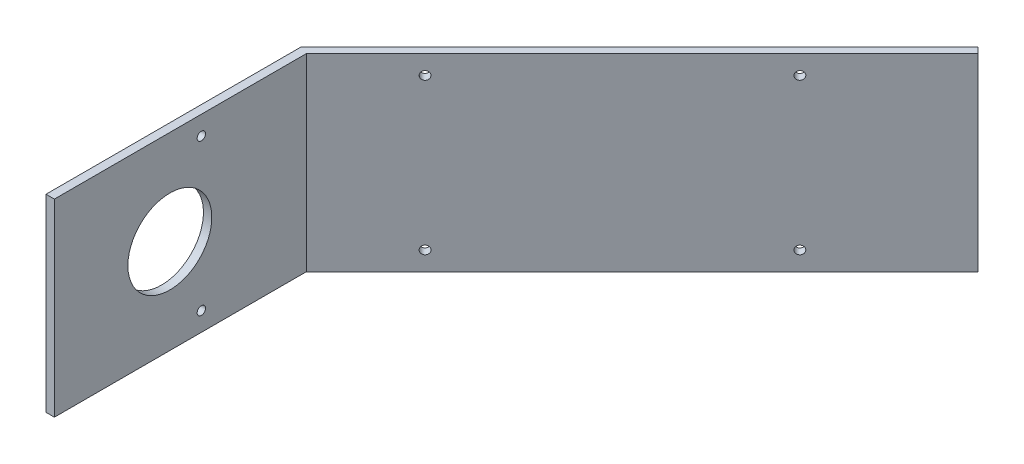
ISO-10303-21;
HEADER;
FILE_DESCRIPTION(('STEP AP214'),'2;1');
FILE_NAME('part.step','',(''),(''),'','','');
FILE_SCHEMA(('AUTOMOTIVE_DESIGN { 1 0 10303 214 1 1 1 1 }'));
ENDSEC;
DATA;
#1=APPLICATION_CONTEXT('core data for automotive mechanical design processes');
#2=APPLICATION_PROTOCOL_DEFINITION('international standard','automotive_design',2000,#1);
#3=PRODUCT_CONTEXT('',#1,'mechanical');
#4=PRODUCT('Part','Part','',(#3));
#5=PRODUCT_RELATED_PRODUCT_CATEGORY('part','',(#4));
#6=PRODUCT_DEFINITION_FORMATION('','',#4);
#7=PRODUCT_DEFINITION_CONTEXT('part definition',#1,'design');
#8=PRODUCT_DEFINITION('design','',#6,#7);
#9=PRODUCT_DEFINITION_SHAPE('','',#8);
#10=(LENGTH_UNIT() NAMED_UNIT(*) SI_UNIT(.MILLI.,.METRE.));
#11=(NAMED_UNIT(*) PLANE_ANGLE_UNIT() SI_UNIT($,.RADIAN.));
#12=(NAMED_UNIT(*) SI_UNIT($,.STERADIAN.) SOLID_ANGLE_UNIT());
#13=UNCERTAINTY_MEASURE_WITH_UNIT(LENGTH_MEASURE(1.E-05),#10,'distance_accuracy_value','');
#14=(GEOMETRIC_REPRESENTATION_CONTEXT(3) GLOBAL_UNCERTAINTY_ASSIGNED_CONTEXT((#13)) GLOBAL_UNIT_ASSIGNED_CONTEXT((#10,
#11,#12)) REPRESENTATION_CONTEXT('',''));
#15=CARTESIAN_POINT('',(0.,0.,0.));
#16=DIRECTION('',(0.,0.,1.));
#17=DIRECTION('',(1.,0.,0.));
#18=AXIS2_PLACEMENT_3D('',#15,#16,#17);
#19=CARTESIAN_POINT('',(0.,45.,0.));
#20=DIRECTION('',(0.,0.,-1.));
#21=DIRECTION('',(-1.,0.,0.));
#22=AXIS2_PLACEMENT_3D('',#19,#20,#21);
#23=PLANE('',#22);
#24=DIRECTION('',(1.,0.,0.));
#25=VECTOR('',#24,1.);
#26=CARTESIAN_POINT('',(0.,-45.,0.));
#27=LINE('',#26,#25);
#28=CARTESIAN_POINT('',(-4.,-45.,0.));
#29=VERTEX_POINT('',#28);
#30=CARTESIAN_POINT('',(0.,-45.,0.));
#31=VERTEX_POINT('',#30);
#32=EDGE_CURVE('E123',#29,#31,#27,.T.);
#33=ORIENTED_EDGE('',*,*,#32,.T.);
#34=DIRECTION('',(0.,-1.,0.));
#35=VECTOR('',#34,1.);
#36=CARTESIAN_POINT('',(0.,45.,0.));
#37=LINE('',#36,#35);
#38=CARTESIAN_POINT('',(0.,45.,0.));
#39=VERTEX_POINT('',#38);
#40=EDGE_CURVE('E11',#39,#31,#37,.T.);
#41=ORIENTED_EDGE('',*,*,#40,.F.);
#42=DIRECTION('',(1.,0.,0.));
#43=VECTOR('',#42,1.);
#44=CARTESIAN_POINT('',(0.,45.,0.));
#45=LINE('',#44,#43);
#46=CARTESIAN_POINT('',(-4.,45.,0.));
#47=VERTEX_POINT('',#46);
#48=EDGE_CURVE('E134',#47,#39,#45,.T.);
#49=ORIENTED_EDGE('',*,*,#48,.F.);
#50=DIRECTION('',(0.,-1.,0.));
#51=VECTOR('',#50,1.);
#52=CARTESIAN_POINT('',(-4.,45.,0.));
#53=LINE('',#52,#51);
#54=EDGE_CURVE('E119',#47,#29,#53,.T.);
#55=ORIENTED_EDGE('',*,*,#54,.T.);
#56=EDGE_LOOP('',(#33,#41,#49,#55));
#57=FACE_BOUND('',#56,.T.);
#58=ADVANCED_FACE('F37',(#57),#23,.F.);
#59=CARTESIAN_POINT('',(0.,45.,0.));
#60=DIRECTION('',(-1.,0.,0.));
#61=DIRECTION('',(0.,0.,1.));
#62=AXIS2_PLACEMENT_3D('',#59,#60,#61);
#63=PLANE('',#62);
#64=CARTESIAN_POINT('',(0.,0.,-55.));
#65=DIRECTION('',(-1.,0.,0.));
#66=DIRECTION('',(0.,0.,1.));
#67=AXIS2_PLACEMENT_3D('',#64,#65,#66);
#68=CIRCLE('',#67,20.);
#69=CARTESIAN_POINT('',(0.,0.,-35.));
#70=VERTEX_POINT('',#69);
#71=EDGE_CURVE('E340',#70,#70,#68,.T.);
#72=ORIENTED_EDGE('',*,*,#71,.T.);
#73=EDGE_LOOP('',(#72));
#74=FACE_BOUND('',#73,.T.);
#75=CARTESIAN_POINT('',(0.,36.,-70.));
#76=DIRECTION('',(-1.,0.,0.));
#77=DIRECTION('',(0.,0.,1.));
#78=AXIS2_PLACEMENT_3D('',#75,#76,#77);
#79=CIRCLE('',#78,2.);
#80=CARTESIAN_POINT('',(0.,36.,-68.));
#81=VERTEX_POINT('',#80);
#82=EDGE_CURVE('E155',#81,#81,#79,.F.);
#83=ORIENTED_EDGE('',*,*,#82,.F.);
#84=EDGE_LOOP('',(#83));
#85=FACE_BOUND('',#84,.T.);
#86=CARTESIAN_POINT('',(0.,-36.,-70.));
#87=DIRECTION('',(-1.,0.,0.));
#88=DIRECTION('',(0.,0.,1.));
#89=AXIS2_PLACEMENT_3D('',#86,#87,#88);
#90=CIRCLE('',#89,2.);
#91=CARTESIAN_POINT('',(0.,-36.,-68.));
#92=VERTEX_POINT('',#91);
#93=EDGE_CURVE('E127',#92,#92,#90,.T.);
#94=ORIENTED_EDGE('',*,*,#93,.T.);
#95=EDGE_LOOP('',(#94));
#96=FACE_BOUND('',#95,.T.);
#97=DIRECTION('',(0.,0.,-1.));
#98=VECTOR('',#97,1.);
#99=CARTESIAN_POINT('',(0.,-45.,0.));
#100=LINE('',#99,#98);
#101=CARTESIAN_POINT('',(0.,-45.,-120.000000000001));
#102=VERTEX_POINT('',#101);
#103=EDGE_CURVE('E126',#31,#102,#100,.T.);
#104=ORIENTED_EDGE('',*,*,#103,.T.);
#105=DIRECTION('',(0.,-1.,0.));
#106=VECTOR('',#105,1.);
#107=CARTESIAN_POINT('',(0.,45.,-120.000000000001));
#108=LINE('',#107,#106);
#109=CARTESIAN_POINT('',(0.,45.,-120.000000000001));
#110=VERTEX_POINT('',#109);
#111=EDGE_CURVE('E46',#110,#102,#108,.T.);
#112=ORIENTED_EDGE('',*,*,#111,.F.);
#113=DIRECTION('',(0.,0.,-1.));
#114=VECTOR('',#113,1.);
#115=CARTESIAN_POINT('',(0.,45.,0.));
#116=LINE('',#115,#114);
#117=EDGE_CURVE('E92',#39,#110,#116,.T.);
#118=ORIENTED_EDGE('',*,*,#117,.F.);
#119=ORIENTED_EDGE('',*,*,#40,.T.);
#120=EDGE_LOOP('',(#104,#112,#118,#119));
#121=FACE_BOUND('',#120,.T.);
#122=ADVANCED_FACE('F179',(#74,#85,#96,#121),#63,.F.);
#123=CARTESIAN_POINT('',(0.,45.,-120.000000000001));
#124=DIRECTION('',(-0.707106781186546,0.,-0.707106781186549));
#125=DIRECTION('',(-0.707106781186549,0.,0.707106781186546));
#126=AXIS2_PLACEMENT_3D('',#123,#124,#125);
#127=PLANE('',#126);
#128=CARTESIAN_POINT('',(117.573593128807,36.,-237.573593128807));
#129=DIRECTION('',(-0.707106781186546,0.,-0.707106781186549));
#130=DIRECTION('',(0.707106781186549,0.,-0.707106781186546));
#131=AXIS2_PLACEMENT_3D('',#128,#129,#130);
#132=CIRCLE('',#131,2.00000000000001);
#133=CARTESIAN_POINT('',(118.98780669118,36.,-238.98780669118));
#134=VERTEX_POINT('',#133);
#135=EDGE_CURVE('E162',#134,#134,#132,.T.);
#136=ORIENTED_EDGE('',*,*,#135,.T.);
#137=EDGE_LOOP('',(#136));
#138=FACE_BOUND('',#137,.T.);
#139=CARTESIAN_POINT('',(28.2842712474619,36.,-148.284271247462));
#140=DIRECTION('',(-0.707106781186546,0.,-0.707106781186549));
#141=DIRECTION('',(0.707106781186549,0.,-0.707106781186546));
#142=AXIS2_PLACEMENT_3D('',#139,#140,#141);
#143=CIRCLE('',#142,1.99999999999999);
#144=CARTESIAN_POINT('',(29.698484809835,36.,-149.698484809836));
#145=VERTEX_POINT('',#144);
#146=EDGE_CURVE('E151',#145,#145,#143,.T.);
#147=ORIENTED_EDGE('',*,*,#146,.T.);
#148=EDGE_LOOP('',(#147));
#149=FACE_BOUND('',#148,.T.);
#150=CARTESIAN_POINT('',(117.573593128807,-36.,-237.573593128807));
#151=DIRECTION('',(0.707106781186546,0.,0.707106781186549));
#152=DIRECTION('',(0.707106781186549,0.,-0.707106781186546));
#153=AXIS2_PLACEMENT_3D('',#150,#151,#152);
#154=CIRCLE('',#153,2.00000000000001);
#155=CARTESIAN_POINT('',(118.98780669118,-36.,-238.98780669118));
#156=VERTEX_POINT('',#155);
#157=EDGE_CURVE('E147',#156,#156,#154,.T.);
#158=ORIENTED_EDGE('',*,*,#157,.F.);
#159=EDGE_LOOP('',(#158));
#160=FACE_BOUND('',#159,.T.);
#161=CARTESIAN_POINT('',(28.2842712474619,-36.,-148.284271247462));
#162=DIRECTION('',(0.707106781186546,0.,0.707106781186549));
#163=DIRECTION('',(0.707106781186549,0.,-0.707106781186546));
#164=AXIS2_PLACEMENT_3D('',#161,#162,#163);
#165=CIRCLE('',#164,1.99999999999999);
#166=CARTESIAN_POINT('',(29.698484809835,-36.,-149.698484809836));
#167=VERTEX_POINT('',#166);
#168=EDGE_CURVE('E144',#167,#167,#165,.T.);
#169=ORIENTED_EDGE('',*,*,#168,.F.);
#170=EDGE_LOOP('',(#169));
#171=FACE_BOUND('',#170,.T.);
#172=DIRECTION('',(0.707106781186549,0.,-0.707106781186546));
#173=VECTOR('',#172,1.);
#174=CARTESIAN_POINT('',(0.,-45.,-120.000000000001));
#175=LINE('',#174,#173);
#176=CARTESIAN_POINT('',(160.,-45.,-280.));
#177=VERTEX_POINT('',#176);
#178=EDGE_CURVE('E129',#102,#177,#175,.T.);
#179=ORIENTED_EDGE('',*,*,#178,.T.);
#180=DIRECTION('',(0.,-1.,0.));
#181=VECTOR('',#180,1.);
#182=CARTESIAN_POINT('',(160.,45.,-280.));
#183=LINE('',#182,#181);
#184=CARTESIAN_POINT('',(160.,45.,-280.));
#185=VERTEX_POINT('',#184);
#186=EDGE_CURVE('E114',#185,#177,#183,.T.);
#187=ORIENTED_EDGE('',*,*,#186,.F.);
#188=DIRECTION('',(0.707106781186549,0.,-0.707106781186546));
#189=VECTOR('',#188,1.);
#190=CARTESIAN_POINT('',(0.,45.,-120.000000000001));
#191=LINE('',#190,#189);
#192=EDGE_CURVE('E105',#110,#185,#191,.T.);
#193=ORIENTED_EDGE('',*,*,#192,.F.);
#194=ORIENTED_EDGE('',*,*,#111,.T.);
#195=EDGE_LOOP('',(#179,#187,#193,#194));
#196=FACE_BOUND('',#195,.T.);
#197=ADVANCED_FACE('F182',(#138,#149,#160,#171,#196),#127,.F.);
#198=CARTESIAN_POINT('',(160.,45.,-280.));
#199=DIRECTION('',(-0.707106781186547,0.,0.707106781186547));
#200=DIRECTION('',(0.707106781186548,0.,0.707106781186548));
#201=AXIS2_PLACEMENT_3D('',#198,#199,#200);
#202=PLANE('',#201);
#203=DIRECTION('',(-0.707106781186547,0.,-0.707106781186547));
#204=VECTOR('',#203,1.);
#205=CARTESIAN_POINT('',(160.,-45.,-280.));
#206=LINE('',#205,#204);
#207=CARTESIAN_POINT('',(157.171572875254,-45.,-282.828427124746));
#208=VERTEX_POINT('',#207);
#209=EDGE_CURVE('E113',#177,#208,#206,.T.);
#210=ORIENTED_EDGE('',*,*,#209,.T.);
#211=DIRECTION('',(0.,-1.,0.));
#212=VECTOR('',#211,1.);
#213=CARTESIAN_POINT('',(157.171572875254,45.,-282.828427124746));
#214=LINE('',#213,#212);
#215=CARTESIAN_POINT('',(157.171572875254,45.,-282.828427124746));
#216=VERTEX_POINT('',#215);
#217=EDGE_CURVE('E110',#216,#208,#214,.T.);
#218=ORIENTED_EDGE('',*,*,#217,.F.);
#219=DIRECTION('',(-0.707106781186547,0.,-0.707106781186547));
#220=VECTOR('',#219,1.);
#221=CARTESIAN_POINT('',(160.,45.,-280.));
#222=LINE('',#221,#220);
#223=EDGE_CURVE('E99',#185,#216,#222,.T.);
#224=ORIENTED_EDGE('',*,*,#223,.F.);
#225=ORIENTED_EDGE('',*,*,#186,.T.);
#226=EDGE_LOOP('',(#210,#218,#224,#225));
#227=FACE_BOUND('',#226,.T.);
#228=ADVANCED_FACE('F111',(#227),#202,.F.);
#229=CARTESIAN_POINT('',(-4.,45.,-121.656854249493));
#230=DIRECTION('',(0.707106781186546,0.,0.707106781186549));
#231=DIRECTION('',(0.707106781186549,0.,-0.707106781186546));
#232=AXIS2_PLACEMENT_3D('',#229,#230,#231);
#233=PLANE('',#232);
#234=CARTESIAN_POINT('',(114.745166004061,36.,-240.402020253553));
#235=DIRECTION('',(0.707106781186546,0.,0.707106781186549));
#236=DIRECTION('',(0.707106781186549,0.,-0.707106781186546));
#237=AXIS2_PLACEMENT_3D('',#234,#235,#236);
#238=CIRCLE('',#237,2.00000000000001);
#239=CARTESIAN_POINT('',(116.159379566434,36.,-241.816233815927));
#240=VERTEX_POINT('',#239);
#241=EDGE_CURVE('E40',#240,#240,#238,.F.);
#242=ORIENTED_EDGE('',*,*,#241,.F.);
#243=EDGE_LOOP('',(#242));
#244=FACE_BOUND('',#243,.T.);
#245=CARTESIAN_POINT('',(25.4558441227157,36.,-151.112698372209));
#246=DIRECTION('',(0.707106781186546,0.,0.707106781186549));
#247=DIRECTION('',(0.707106781186549,0.,-0.707106781186546));
#248=AXIS2_PLACEMENT_3D('',#245,#246,#247);
#249=CIRCLE('',#248,1.99999999999999);
#250=CARTESIAN_POINT('',(26.8700576850888,36.,-152.526911934582));
#251=VERTEX_POINT('',#250);
#252=EDGE_CURVE('E148',#251,#251,#249,.F.);
#253=ORIENTED_EDGE('',*,*,#252,.F.);
#254=EDGE_LOOP('',(#253));
#255=FACE_BOUND('',#254,.T.);
#256=CARTESIAN_POINT('',(114.745166004061,-36.,-240.402020253553));
#257=DIRECTION('',(0.707106781186546,0.,0.707106781186549));
#258=DIRECTION('',(0.707106781186549,0.,-0.707106781186546));
#259=AXIS2_PLACEMENT_3D('',#256,#257,#258);
#260=CIRCLE('',#259,2.00000000000001);
#261=CARTESIAN_POINT('',(116.159379566434,-36.,-241.816233815927));
#262=VERTEX_POINT('',#261);
#263=EDGE_CURVE('E145',#262,#262,#260,.T.);
#264=ORIENTED_EDGE('',*,*,#263,.T.);
#265=EDGE_LOOP('',(#264));
#266=FACE_BOUND('',#265,.T.);
#267=CARTESIAN_POINT('',(25.4558441227157,-36.,-151.112698372209));
#268=DIRECTION('',(0.707106781186546,0.,0.707106781186549));
#269=DIRECTION('',(0.707106781186549,0.,-0.707106781186546));
#270=AXIS2_PLACEMENT_3D('',#267,#268,#269);
#271=CIRCLE('',#270,1.99999999999999);
#272=CARTESIAN_POINT('',(26.8700576850888,-36.,-152.526911934582));
#273=VERTEX_POINT('',#272);
#274=EDGE_CURVE('E140',#273,#273,#271,.T.);
#275=ORIENTED_EDGE('',*,*,#274,.T.);
#276=EDGE_LOOP('',(#275));
#277=FACE_BOUND('',#276,.T.);
#278=DIRECTION('',(-0.707106781186549,0.,0.707106781186546));
#279=VECTOR('',#278,1.);
#280=CARTESIAN_POINT('',(-4.,-45.,-121.656854249493));
#281=LINE('',#280,#279);
#282=CARTESIAN_POINT('',(-4.,-45.,-121.656854249493));
#283=VERTEX_POINT('',#282);
#284=EDGE_CURVE('E78',#208,#283,#281,.T.);
#285=ORIENTED_EDGE('',*,*,#284,.T.);
#286=DIRECTION('',(0.,-1.,0.));
#287=VECTOR('',#286,1.);
#288=CARTESIAN_POINT('',(-4.,45.,-121.656854249493));
#289=LINE('',#288,#287);
#290=CARTESIAN_POINT('',(-4.,45.,-121.656854249493));
#291=VERTEX_POINT('',#290);
#292=EDGE_CURVE('E115',#291,#283,#289,.T.);
#293=ORIENTED_EDGE('',*,*,#292,.F.);
#294=DIRECTION('',(-0.707106781186549,0.,0.707106781186546));
#295=VECTOR('',#294,1.);
#296=CARTESIAN_POINT('',(-4.,45.,-121.656854249493));
#297=LINE('',#296,#295);
#298=EDGE_CURVE('E103',#216,#291,#297,.T.);
#299=ORIENTED_EDGE('',*,*,#298,.F.);
#300=ORIENTED_EDGE('',*,*,#217,.T.);
#301=EDGE_LOOP('',(#285,#293,#299,#300));
#302=FACE_BOUND('',#301,.T.);
#303=ADVANCED_FACE('F117',(#244,#255,#266,#277,#302),#233,.F.);
#304=CARTESIAN_POINT('',(-4.,45.,0.));
#305=DIRECTION('',(1.,0.,0.));
#306=DIRECTION('',(0.,0.,-1.));
#307=AXIS2_PLACEMENT_3D('',#304,#305,#306);
#308=PLANE('',#307);
#309=CARTESIAN_POINT('',(-4.,0.,-55.));
#310=DIRECTION('',(-1.,0.,0.));
#311=DIRECTION('',(0.,0.,1.));
#312=AXIS2_PLACEMENT_3D('',#309,#310,#311);
#313=CIRCLE('',#312,20.);
#314=CARTESIAN_POINT('',(-3.99999999999999,0.,-35.));
#315=VERTEX_POINT('',#314);
#316=EDGE_CURVE('E338',#315,#315,#313,.T.);
#317=ORIENTED_EDGE('',*,*,#316,.F.);
#318=EDGE_LOOP('',(#317));
#319=FACE_BOUND('',#318,.T.);
#320=CARTESIAN_POINT('',(-4.,36.,-70.));
#321=DIRECTION('',(1.,0.,0.));
#322=DIRECTION('',(0.,0.,1.));
#323=AXIS2_PLACEMENT_3D('',#320,#321,#322);
#324=CIRCLE('',#323,2.);
#325=CARTESIAN_POINT('',(-3.99999999999999,36.,-68.));
#326=VERTEX_POINT('',#325);
#327=EDGE_CURVE('E150',#326,#326,#324,.T.);
#328=ORIENTED_EDGE('',*,*,#327,.T.);
#329=EDGE_LOOP('',(#328));
#330=FACE_BOUND('',#329,.T.);
#331=CARTESIAN_POINT('',(-4.,-36.,-70.));
#332=DIRECTION('',(-1.,0.,0.));
#333=DIRECTION('',(0.,0.,1.));
#334=AXIS2_PLACEMENT_3D('',#331,#332,#333);
#335=CIRCLE('',#334,2.);
#336=CARTESIAN_POINT('',(-3.99999999999999,-36.,-68.));
#337=VERTEX_POINT('',#336);
#338=EDGE_CURVE('E143',#337,#337,#335,.T.);
#339=ORIENTED_EDGE('',*,*,#338,.F.);
#340=EDGE_LOOP('',(#339));
#341=FACE_BOUND('',#340,.T.);
#342=DIRECTION('',(0.,0.,1.));
#343=VECTOR('',#342,1.);
#344=CARTESIAN_POINT('',(-4.,-45.,0.));
#345=LINE('',#344,#343);
#346=EDGE_CURVE('E84',#283,#29,#345,.T.);
#347=ORIENTED_EDGE('',*,*,#346,.T.);
#348=ORIENTED_EDGE('',*,*,#54,.F.);
#349=DIRECTION('',(0.,0.,1.));
#350=VECTOR('',#349,1.);
#351=CARTESIAN_POINT('',(-4.,45.,0.));
#352=LINE('',#351,#350);
#353=EDGE_CURVE('E55',#291,#47,#352,.T.);
#354=ORIENTED_EDGE('',*,*,#353,.F.);
#355=ORIENTED_EDGE('',*,*,#292,.T.);
#356=EDGE_LOOP('',(#347,#348,#354,#355));
#357=FACE_BOUND('',#356,.T.);
#358=ADVANCED_FACE('F187',(#319,#330,#341,#357),#308,.F.);
#359=CARTESIAN_POINT('',(0.,45.,0.));
#360=DIRECTION('',(0.,-1.,0.));
#361=DIRECTION('',(0.,0.,-1.));
#362=AXIS2_PLACEMENT_3D('',#359,#360,#361);
#363=PLANE('',#362);
#364=ORIENTED_EDGE('',*,*,#48,.T.);
#365=ORIENTED_EDGE('',*,*,#117,.T.);
#366=ORIENTED_EDGE('',*,*,#192,.T.);
#367=ORIENTED_EDGE('',*,*,#223,.T.);
#368=ORIENTED_EDGE('',*,*,#298,.T.);
#369=ORIENTED_EDGE('',*,*,#353,.T.);
#370=EDGE_LOOP('',(#364,#365,#366,#367,#368,#369));
#371=FACE_BOUND('',#370,.T.);
#372=ADVANCED_FACE('F101',(#371),#363,.F.);
#373=CARTESIAN_POINT('',(0.,-45.,0.));
#374=DIRECTION('',(0.,-1.,0.));
#375=DIRECTION('',(0.,0.,-1.));
#376=AXIS2_PLACEMENT_3D('',#373,#374,#375);
#377=PLANE('',#376);
#378=ORIENTED_EDGE('',*,*,#32,.F.);
#379=ORIENTED_EDGE('',*,*,#346,.F.);
#380=ORIENTED_EDGE('',*,*,#284,.F.);
#381=ORIENTED_EDGE('',*,*,#209,.F.);
#382=ORIENTED_EDGE('',*,*,#178,.F.);
#383=ORIENTED_EDGE('',*,*,#103,.F.);
#384=EDGE_LOOP('',(#378,#379,#380,#381,#382,#383));
#385=FACE_BOUND('',#384,.T.);
#386=ADVANCED_FACE('F185',(#385),#377,.T.);
#387=CARTESIAN_POINT('',(86.,-36.,-70.));
#388=DIRECTION('',(-1.,0.,0.));
#389=DIRECTION('',(0.,0.,1.));
#390=AXIS2_PLACEMENT_3D('',#387,#388,#389);
#391=CYLINDRICAL_SURFACE('',#390,2.);
#392=CARTESIAN_POINT('',(-3.99999999999999,-36.,-68.));
#393=CARTESIAN_POINT('',(-3.95833333333332,-36.,-68.));
#394=CARTESIAN_POINT('',(-3.91666666666666,-36.,-68.));
#395=CARTESIAN_POINT('',(-3.83333333333332,-36.,-68.));
#396=CARTESIAN_POINT('',(-3.79166666666666,-36.,-68.));
#397=CARTESIAN_POINT('',(-3.70833333333332,-36.,-68.));
#398=CARTESIAN_POINT('',(-3.66666666666666,-36.,-68.));
#399=CARTESIAN_POINT('',(-3.58333333333332,-36.,-68.));
#400=CARTESIAN_POINT('',(-3.54166666666666,-36.,-68.));
#401=CARTESIAN_POINT('',(-3.45833333333332,-36.,-68.));
#402=CARTESIAN_POINT('',(-3.41666666666666,-36.,-68.));
#403=CARTESIAN_POINT('',(-3.33333333333332,-36.,-68.));
#404=CARTESIAN_POINT('',(-3.29166666666666,-36.,-68.));
#405=CARTESIAN_POINT('',(-3.20833333333332,-36.,-68.));
#406=CARTESIAN_POINT('',(-3.16666666666666,-36.,-68.));
#407=CARTESIAN_POINT('',(-3.08333333333332,-36.,-68.));
#408=CARTESIAN_POINT('',(-3.04166666666666,-36.,-68.));
#409=CARTESIAN_POINT('',(-2.95833333333332,-36.,-68.));
#410=CARTESIAN_POINT('',(-2.91666666666666,-36.,-68.));
#411=CARTESIAN_POINT('',(-2.83333333333332,-36.,-68.));
#412=CARTESIAN_POINT('',(-2.79166666666666,-36.,-68.));
#413=CARTESIAN_POINT('',(-2.70833333333332,-36.,-68.));
#414=CARTESIAN_POINT('',(-2.66666666666666,-36.,-68.));
#415=CARTESIAN_POINT('',(-2.58333333333332,-36.,-68.));
#416=CARTESIAN_POINT('',(-2.54166666666665,-36.,-68.));
#417=CARTESIAN_POINT('',(-2.45833333333332,-36.,-68.));
#418=CARTESIAN_POINT('',(-2.41666666666665,-36.,-68.));
#419=CARTESIAN_POINT('',(-2.33333333333332,-36.,-68.));
#420=CARTESIAN_POINT('',(-2.29166666666665,-36.,-68.));
#421=CARTESIAN_POINT('',(-2.20833333333332,-36.,-68.));
#422=CARTESIAN_POINT('',(-2.16666666666665,-36.,-68.));
#423=CARTESIAN_POINT('',(-2.08333333333332,-36.,-68.));
#424=CARTESIAN_POINT('',(-2.04166666666665,-36.,-68.));
#425=CARTESIAN_POINT('',(-1.95833333333332,-36.,-68.));
#426=CARTESIAN_POINT('',(-1.91666666666665,-36.,-68.));
#427=CARTESIAN_POINT('',(-1.83333333333332,-36.,-68.));
#428=CARTESIAN_POINT('',(-1.79166666666665,-36.,-68.));
#429=CARTESIAN_POINT('',(-1.70833333333332,-36.,-68.));
#430=CARTESIAN_POINT('',(-1.66666666666665,-36.,-68.));
#431=CARTESIAN_POINT('',(-1.58333333333332,-36.,-68.));
#432=CARTESIAN_POINT('',(-1.54166666666665,-36.,-68.));
#433=CARTESIAN_POINT('',(-1.45833333333332,-36.,-68.));
#434=CARTESIAN_POINT('',(-1.41666666666665,-36.,-68.));
#435=CARTESIAN_POINT('',(-1.33333333333332,-36.,-68.));
#436=CARTESIAN_POINT('',(-1.29166666666665,-36.,-68.));
#437=CARTESIAN_POINT('',(-1.20833333333332,-36.,-68.));
#438=CARTESIAN_POINT('',(-1.16666666666665,-36.,-68.));
#439=CARTESIAN_POINT('',(-1.08333333333332,-36.,-68.));
#440=CARTESIAN_POINT('',(-1.04166666666665,-36.,-68.));
#441=CARTESIAN_POINT('',(-0.95833333333332,-36.,-68.));
#442=CARTESIAN_POINT('',(-0.916666666666654,-36.,-68.));
#443=CARTESIAN_POINT('',(-0.83333333333332,-36.,-68.));
#444=CARTESIAN_POINT('',(-0.791666666666654,-36.,-68.));
#445=CARTESIAN_POINT('',(-0.70833333333332,-36.,-68.));
#446=CARTESIAN_POINT('',(-0.666666666666653,-36.,-68.));
#447=CARTESIAN_POINT('',(-0.58333333333332,-36.,-68.));
#448=CARTESIAN_POINT('',(-0.541666666666653,-36.,-68.));
#449=CARTESIAN_POINT('',(-0.45833333333332,-36.,-68.));
#450=CARTESIAN_POINT('',(-0.416666666666653,-36.,-68.));
#451=CARTESIAN_POINT('',(-0.33333333333332,-36.,-68.));
#452=CARTESIAN_POINT('',(-0.291666666666653,-36.,-68.));
#453=CARTESIAN_POINT('',(-0.20833333333332,-36.,-68.));
#454=CARTESIAN_POINT('',(-0.166666666666653,-36.,-68.));
#455=CARTESIAN_POINT('',(-0.0833333333333195,-36.,-68.));
#456=CARTESIAN_POINT('',(-0.0416666666666528,-36.,-68.));
#457=CARTESIAN_POINT('',(0.,-36.,-68.));
#458=B_SPLINE_CURVE_WITH_KNOTS('',3,(#392,#393,#394,#395,#396,#397,#398,#399,#400,#401,#402,
#403,#404,#405,#406,#407,#408,#409,#410,#411,#412,#413,#414,#415,#416,#417,#418,#419,#420,#421,
#422,#423,#424,#425,#426,#427,#428,#429,#430,#431,#432,#433,#434,#435,#436,#437,#438,#439,#440,
#441,#442,#443,#444,#445,#446,#447,#448,#449,#450,#451,#452,#453,#454,#455,#456,#457),
.UNSPECIFIED.,.F.,.F.,(4,2,2,2,2,2,2,2,2,2,2,2,2,2,2,2,2,2,2,2,2,2,2,2,2,2,2,2,2,2,2,2,4),(0.,
0.125,0.25,0.375,0.5,0.625000000000001,0.750000000000001,0.875000000000001,1.,1.125,1.25,1.375,
1.5,1.625,1.75,1.875,2.,2.125,2.25,2.375,2.5,2.625,2.75,2.875,3.,3.125,3.25,3.375,3.5,3.625,
3.75,3.875,4.),.UNSPECIFIED.);
#459=EDGE_CURVE('BSEAM292',#337,#92,#458,.T.);
#460=ORIENTED_EDGE('',*,*,#338,.T.);
#461=ORIENTED_EDGE('',*,*,#93,.F.);
#462=ORIENTED_EDGE('',*,*,#459,.T.);
#463=ORIENTED_EDGE('',*,*,#459,.F.);
#464=EDGE_LOOP('',(#460,#462,#461,#463));
#465=FACE_BOUND('',#464,.T.);
#466=ADVANCED_FACE('F292',(#465),#391,.F.);
#467=CARTESIAN_POINT('',(-35.3553390593273,-36.,-211.923881554252));
#468=DIRECTION('',(0.707106781186546,0.,0.707106781186549));
#469=DIRECTION('',(0.707106781186549,0.,-0.707106781186546));
#470=AXIS2_PLACEMENT_3D('',#467,#468,#469);
#471=CYLINDRICAL_SURFACE('',#470,1.99999999999999);
#472=ORIENTED_EDGE('',*,*,#168,.T.);
#473=EDGE_LOOP('',(#472));
#474=FACE_BOUND('',#473,.T.);
#475=ORIENTED_EDGE('',*,*,#274,.F.);
#476=EDGE_LOOP('',(#475));
#477=FACE_BOUND('',#476,.T.);
#478=ADVANCED_FACE('F288',(#474,#477),#471,.F.);
#479=CARTESIAN_POINT('',(53.9339828220178,-36.,-301.213203435597));
#480=DIRECTION('',(0.707106781186546,0.,0.707106781186549));
#481=DIRECTION('',(0.707106781186549,0.,-0.707106781186546));
#482=AXIS2_PLACEMENT_3D('',#479,#480,#481);
#483=CYLINDRICAL_SURFACE('',#482,2.00000000000001);
#484=ORIENTED_EDGE('',*,*,#157,.T.);
#485=EDGE_LOOP('',(#484));
#486=FACE_BOUND('',#485,.T.);
#487=ORIENTED_EDGE('',*,*,#263,.F.);
#488=EDGE_LOOP('',(#487));
#489=FACE_BOUND('',#488,.T.);
#490=ADVANCED_FACE('F239',(#486,#489),#483,.F.);
#491=CARTESIAN_POINT('',(86.,36.,-70.));
#492=DIRECTION('',(-1.,0.,0.));
#493=DIRECTION('',(0.,0.,1.));
#494=AXIS2_PLACEMENT_3D('',#491,#492,#493);
#495=CYLINDRICAL_SURFACE('',#494,2.);
#496=CARTESIAN_POINT('',(-3.99999999999999,36.,-68.));
#497=CARTESIAN_POINT('',(-3.95833333333332,36.,-68.));
#498=CARTESIAN_POINT('',(-3.91666666666666,36.,-68.));
#499=CARTESIAN_POINT('',(-3.83333333333332,36.,-68.));
#500=CARTESIAN_POINT('',(-3.79166666666666,36.,-68.));
#501=CARTESIAN_POINT('',(-3.70833333333332,36.,-68.));
#502=CARTESIAN_POINT('',(-3.66666666666666,36.,-68.));
#503=CARTESIAN_POINT('',(-3.58333333333332,36.,-68.));
#504=CARTESIAN_POINT('',(-3.54166666666666,36.,-68.));
#505=CARTESIAN_POINT('',(-3.45833333333332,36.,-68.));
#506=CARTESIAN_POINT('',(-3.41666666666666,36.,-68.));
#507=CARTESIAN_POINT('',(-3.33333333333332,36.,-68.));
#508=CARTESIAN_POINT('',(-3.29166666666666,36.,-68.));
#509=CARTESIAN_POINT('',(-3.20833333333332,36.,-68.));
#510=CARTESIAN_POINT('',(-3.16666666666666,36.,-68.));
#511=CARTESIAN_POINT('',(-3.08333333333332,36.,-68.));
#512=CARTESIAN_POINT('',(-3.04166666666666,36.,-68.));
#513=CARTESIAN_POINT('',(-2.95833333333332,36.,-68.));
#514=CARTESIAN_POINT('',(-2.91666666666666,36.,-68.));
#515=CARTESIAN_POINT('',(-2.83333333333332,36.,-68.));
#516=CARTESIAN_POINT('',(-2.79166666666666,36.,-68.));
#517=CARTESIAN_POINT('',(-2.70833333333332,36.,-68.));
#518=CARTESIAN_POINT('',(-2.66666666666666,36.,-68.));
#519=CARTESIAN_POINT('',(-2.58333333333332,36.,-68.));
#520=CARTESIAN_POINT('',(-2.54166666666665,36.,-68.));
#521=CARTESIAN_POINT('',(-2.45833333333332,36.,-68.));
#522=CARTESIAN_POINT('',(-2.41666666666665,36.,-68.));
#523=CARTESIAN_POINT('',(-2.33333333333332,36.,-68.));
#524=CARTESIAN_POINT('',(-2.29166666666665,36.,-68.));
#525=CARTESIAN_POINT('',(-2.20833333333332,36.,-68.));
#526=CARTESIAN_POINT('',(-2.16666666666665,36.,-68.));
#527=CARTESIAN_POINT('',(-2.08333333333332,36.,-68.));
#528=CARTESIAN_POINT('',(-2.04166666666665,36.,-68.));
#529=CARTESIAN_POINT('',(-1.95833333333332,36.,-68.));
#530=CARTESIAN_POINT('',(-1.91666666666665,36.,-68.));
#531=CARTESIAN_POINT('',(-1.83333333333332,36.,-68.));
#532=CARTESIAN_POINT('',(-1.79166666666665,36.,-68.));
#533=CARTESIAN_POINT('',(-1.70833333333332,36.,-68.));
#534=CARTESIAN_POINT('',(-1.66666666666665,36.,-68.));
#535=CARTESIAN_POINT('',(-1.58333333333332,36.,-68.));
#536=CARTESIAN_POINT('',(-1.54166666666665,36.,-68.));
#537=CARTESIAN_POINT('',(-1.45833333333332,36.,-68.));
#538=CARTESIAN_POINT('',(-1.41666666666665,36.,-68.));
#539=CARTESIAN_POINT('',(-1.33333333333332,36.,-68.));
#540=CARTESIAN_POINT('',(-1.29166666666665,36.,-68.));
#541=CARTESIAN_POINT('',(-1.20833333333332,36.,-68.));
#542=CARTESIAN_POINT('',(-1.16666666666665,36.,-68.));
#543=CARTESIAN_POINT('',(-1.08333333333332,36.,-68.));
#544=CARTESIAN_POINT('',(-1.04166666666665,36.,-68.));
#545=CARTESIAN_POINT('',(-0.95833333333332,36.,-68.));
#546=CARTESIAN_POINT('',(-0.916666666666654,36.,-68.));
#547=CARTESIAN_POINT('',(-0.83333333333332,36.,-68.));
#548=CARTESIAN_POINT('',(-0.791666666666654,36.,-68.));
#549=CARTESIAN_POINT('',(-0.70833333333332,36.,-68.));
#550=CARTESIAN_POINT('',(-0.666666666666653,36.,-68.));
#551=CARTESIAN_POINT('',(-0.58333333333332,36.,-68.));
#552=CARTESIAN_POINT('',(-0.541666666666653,36.,-68.));
#553=CARTESIAN_POINT('',(-0.45833333333332,36.,-68.));
#554=CARTESIAN_POINT('',(-0.416666666666653,36.,-68.));
#555=CARTESIAN_POINT('',(-0.33333333333332,36.,-68.));
#556=CARTESIAN_POINT('',(-0.291666666666653,36.,-68.));
#557=CARTESIAN_POINT('',(-0.20833333333332,36.,-68.));
#558=CARTESIAN_POINT('',(-0.166666666666653,36.,-68.));
#559=CARTESIAN_POINT('',(-0.0833333333333195,36.,-68.));
#560=CARTESIAN_POINT('',(-0.0416666666666528,36.,-68.));
#561=CARTESIAN_POINT('',(0.,36.,-68.));
#562=B_SPLINE_CURVE_WITH_KNOTS('',3,(#496,#497,#498,#499,#500,#501,#502,#503,#504,#505,#506,
#507,#508,#509,#510,#511,#512,#513,#514,#515,#516,#517,#518,#519,#520,#521,#522,#523,#524,#525,
#526,#527,#528,#529,#530,#531,#532,#533,#534,#535,#536,#537,#538,#539,#540,#541,#542,#543,#544,
#545,#546,#547,#548,#549,#550,#551,#552,#553,#554,#555,#556,#557,#558,#559,#560,#561),
.UNSPECIFIED.,.F.,.F.,(4,2,2,2,2,2,2,2,2,2,2,2,2,2,2,2,2,2,2,2,2,2,2,2,2,2,2,2,2,2,2,2,4),(0.,
0.125,0.25,0.375,0.5,0.625000000000001,0.750000000000001,0.875000000000001,1.,1.125,1.25,1.375,
1.5,1.625,1.75,1.875,2.,2.125,2.25,2.375,2.5,2.625,2.75,2.875,3.,3.125,3.25,3.375,3.5,3.625,
3.75,3.875,4.),.UNSPECIFIED.);
#563=EDGE_CURVE('BSEAM233',#326,#81,#562,.T.);
#564=ORIENTED_EDGE('',*,*,#327,.F.);
#565=ORIENTED_EDGE('',*,*,#82,.T.);
#566=ORIENTED_EDGE('',*,*,#563,.T.);
#567=ORIENTED_EDGE('',*,*,#563,.F.);
#568=EDGE_LOOP('',(#564,#566,#565,#567));
#569=FACE_BOUND('',#568,.T.);
#570=ADVANCED_FACE('F233',(#569),#495,.F.);
#571=CARTESIAN_POINT('',(-35.3553390593273,36.,-211.923881554252));
#572=DIRECTION('',(0.707106781186546,0.,0.707106781186549));
#573=DIRECTION('',(0.707106781186549,0.,-0.707106781186546));
#574=AXIS2_PLACEMENT_3D('',#571,#572,#573);
#575=CYLINDRICAL_SURFACE('',#574,1.99999999999999);
#576=ORIENTED_EDGE('',*,*,#146,.F.);
#577=EDGE_LOOP('',(#576));
#578=FACE_BOUND('',#577,.T.);
#579=ORIENTED_EDGE('',*,*,#252,.T.);
#580=EDGE_LOOP('',(#579));
#581=FACE_BOUND('',#580,.T.);
#582=ADVANCED_FACE('F238',(#578,#581),#575,.F.);
#583=CARTESIAN_POINT('',(53.9339828220178,36.,-301.213203435597));
#584=DIRECTION('',(0.707106781186546,0.,0.707106781186549));
#585=DIRECTION('',(0.707106781186549,0.,-0.707106781186546));
#586=AXIS2_PLACEMENT_3D('',#583,#584,#585);
#587=CYLINDRICAL_SURFACE('',#586,2.00000000000001);
#588=ORIENTED_EDGE('',*,*,#135,.F.);
#589=EDGE_LOOP('',(#588));
#590=FACE_BOUND('',#589,.T.);
#591=ORIENTED_EDGE('',*,*,#241,.T.);
#592=EDGE_LOOP('',(#591));
#593=FACE_BOUND('',#592,.T.);
#594=ADVANCED_FACE('F251',(#590,#593),#587,.F.);
#595=CARTESIAN_POINT('',(86.,0.,-55.));
#596=DIRECTION('',(-1.,0.,0.));
#597=DIRECTION('',(0.,0.,1.));
#598=AXIS2_PLACEMENT_3D('',#595,#596,#597);
#599=CYLINDRICAL_SURFACE('',#598,20.);
#600=CARTESIAN_POINT('',(-3.99999999999999,0.,-35.));
#601=CARTESIAN_POINT('',(-3.95833333333332,0.,-35.));
#602=CARTESIAN_POINT('',(-3.91666666666666,0.,-35.));
#603=CARTESIAN_POINT('',(-3.83333333333332,0.,-35.));
#604=CARTESIAN_POINT('',(-3.79166666666666,0.,-35.));
#605=CARTESIAN_POINT('',(-3.70833333333332,0.,-35.));
#606=CARTESIAN_POINT('',(-3.66666666666666,0.,-35.));
#607=CARTESIAN_POINT('',(-3.58333333333332,0.,-35.));
#608=CARTESIAN_POINT('',(-3.54166666666666,0.,-35.));
#609=CARTESIAN_POINT('',(-3.45833333333332,0.,-35.));
#610=CARTESIAN_POINT('',(-3.41666666666666,0.,-35.));
#611=CARTESIAN_POINT('',(-3.33333333333332,0.,-35.));
#612=CARTESIAN_POINT('',(-3.29166666666666,0.,-35.));
#613=CARTESIAN_POINT('',(-3.20833333333332,0.,-35.));
#614=CARTESIAN_POINT('',(-3.16666666666666,0.,-35.));
#615=CARTESIAN_POINT('',(-3.08333333333332,0.,-35.));
#616=CARTESIAN_POINT('',(-3.04166666666666,0.,-35.));
#617=CARTESIAN_POINT('',(-2.95833333333332,0.,-35.));
#618=CARTESIAN_POINT('',(-2.91666666666666,0.,-35.));
#619=CARTESIAN_POINT('',(-2.83333333333332,0.,-35.));
#620=CARTESIAN_POINT('',(-2.79166666666666,0.,-35.));
#621=CARTESIAN_POINT('',(-2.70833333333332,0.,-35.));
#622=CARTESIAN_POINT('',(-2.66666666666666,0.,-35.));
#623=CARTESIAN_POINT('',(-2.58333333333332,0.,-35.));
#624=CARTESIAN_POINT('',(-2.54166666666665,0.,-35.));
#625=CARTESIAN_POINT('',(-2.45833333333332,0.,-35.));
#626=CARTESIAN_POINT('',(-2.41666666666665,0.,-35.));
#627=CARTESIAN_POINT('',(-2.33333333333332,0.,-35.));
#628=CARTESIAN_POINT('',(-2.29166666666665,0.,-35.));
#629=CARTESIAN_POINT('',(-2.20833333333332,0.,-35.));
#630=CARTESIAN_POINT('',(-2.16666666666665,0.,-35.));
#631=CARTESIAN_POINT('',(-2.08333333333332,0.,-35.));
#632=CARTESIAN_POINT('',(-2.04166666666665,0.,-35.));
#633=CARTESIAN_POINT('',(-1.95833333333332,0.,-35.));
#634=CARTESIAN_POINT('',(-1.91666666666665,0.,-35.));
#635=CARTESIAN_POINT('',(-1.83333333333332,0.,-35.));
#636=CARTESIAN_POINT('',(-1.79166666666665,0.,-35.));
#637=CARTESIAN_POINT('',(-1.70833333333332,0.,-35.));
#638=CARTESIAN_POINT('',(-1.66666666666665,0.,-35.));
#639=CARTESIAN_POINT('',(-1.58333333333332,0.,-35.));
#640=CARTESIAN_POINT('',(-1.54166666666665,0.,-35.));
#641=CARTESIAN_POINT('',(-1.45833333333332,0.,-35.));
#642=CARTESIAN_POINT('',(-1.41666666666665,0.,-35.));
#643=CARTESIAN_POINT('',(-1.33333333333332,0.,-35.));
#644=CARTESIAN_POINT('',(-1.29166666666665,0.,-35.));
#645=CARTESIAN_POINT('',(-1.20833333333332,0.,-35.));
#646=CARTESIAN_POINT('',(-1.16666666666665,0.,-35.));
#647=CARTESIAN_POINT('',(-1.08333333333332,0.,-35.));
#648=CARTESIAN_POINT('',(-1.04166666666665,0.,-35.));
#649=CARTESIAN_POINT('',(-0.95833333333332,0.,-35.));
#650=CARTESIAN_POINT('',(-0.916666666666654,0.,-35.));
#651=CARTESIAN_POINT('',(-0.83333333333332,0.,-35.));
#652=CARTESIAN_POINT('',(-0.791666666666654,0.,-35.));
#653=CARTESIAN_POINT('',(-0.70833333333332,0.,-35.));
#654=CARTESIAN_POINT('',(-0.666666666666653,0.,-35.));
#655=CARTESIAN_POINT('',(-0.58333333333332,0.,-35.));
#656=CARTESIAN_POINT('',(-0.541666666666653,0.,-35.));
#657=CARTESIAN_POINT('',(-0.45833333333332,0.,-35.));
#658=CARTESIAN_POINT('',(-0.416666666666653,0.,-35.));
#659=CARTESIAN_POINT('',(-0.33333333333332,0.,-35.));
#660=CARTESIAN_POINT('',(-0.291666666666653,0.,-35.));
#661=CARTESIAN_POINT('',(-0.20833333333332,0.,-35.));
#662=CARTESIAN_POINT('',(-0.166666666666653,0.,-35.));
#663=CARTESIAN_POINT('',(-0.0833333333333195,0.,-35.));
#664=CARTESIAN_POINT('',(-0.0416666666666528,0.,-35.));
#665=CARTESIAN_POINT('',(0.,0.,-35.));
#666=B_SPLINE_CURVE_WITH_KNOTS('',3,(#600,#601,#602,#603,#604,#605,#606,#607,#608,#609,#610,
#611,#612,#613,#614,#615,#616,#617,#618,#619,#620,#621,#622,#623,#624,#625,#626,#627,#628,#629,
#630,#631,#632,#633,#634,#635,#636,#637,#638,#639,#640,#641,#642,#643,#644,#645,#646,#647,#648,
#649,#650,#651,#652,#653,#654,#655,#656,#657,#658,#659,#660,#661,#662,#663,#664,#665),
.UNSPECIFIED.,.F.,.F.,(4,2,2,2,2,2,2,2,2,2,2,2,2,2,2,2,2,2,2,2,2,2,2,2,2,2,2,2,2,2,2,2,4),(0.,
0.125,0.25,0.375,0.5,0.625000000000001,0.750000000000001,0.875000000000001,1.,1.125,1.25,1.375,
1.5,1.625,1.75,1.875,2.,2.125,2.25,2.375,2.5,2.625,2.75,2.875,3.,3.125,3.25,3.375,3.5,3.625,
3.75,3.875,4.),.UNSPECIFIED.);
#667=EDGE_CURVE('BSEAM260',#315,#70,#666,.T.);
#668=ORIENTED_EDGE('',*,*,#316,.T.);
#669=ORIENTED_EDGE('',*,*,#71,.F.);
#670=ORIENTED_EDGE('',*,*,#667,.T.);
#671=ORIENTED_EDGE('',*,*,#667,.F.);
#672=EDGE_LOOP('',(#668,#670,#669,#671));
#673=FACE_BOUND('',#672,.T.);
#674=ADVANCED_FACE('F260',(#673),#599,.F.);
#675=CLOSED_SHELL('',(#58,#122,#197,#228,#303,#358,#372,#386,#466,#478,#490,#570,#582,#594,#674));
#676=MANIFOLD_SOLID_BREP('B2',#675);
#677=ADVANCED_BREP_SHAPE_REPRESENTATION('',(#18,#676),#14);
#678=SHAPE_DEFINITION_REPRESENTATION(#9,#677);
ENDSEC;
END-ISO-10303-21;
